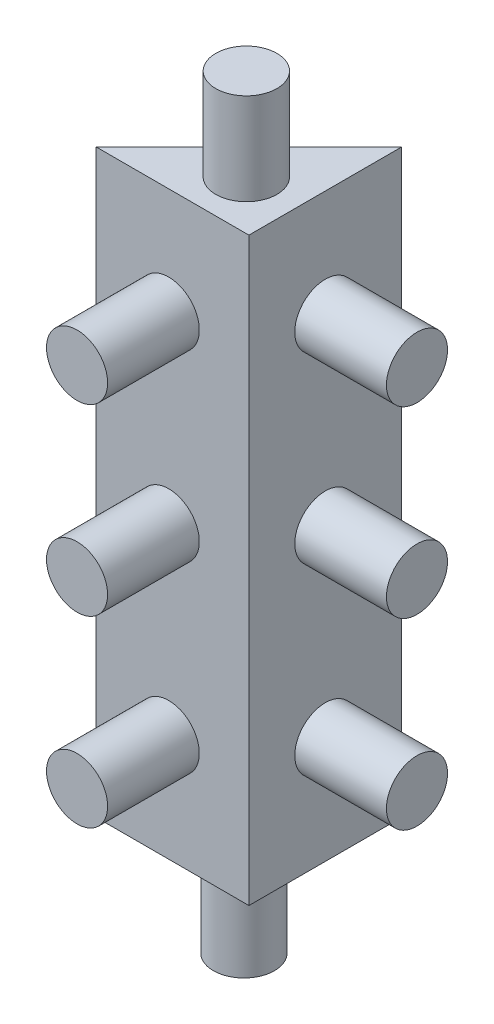
ISO-10303-21;
HEADER;
FILE_DESCRIPTION(('STEP AP214'),'2;1');
FILE_NAME('part.step','',(''),(''),'','','');
FILE_SCHEMA(('AUTOMOTIVE_DESIGN { 1 0 10303 214 1 1 1 1 }'));
ENDSEC;
DATA;
#1=APPLICATION_CONTEXT('core data for automotive mechanical design processes');
#2=APPLICATION_PROTOCOL_DEFINITION('international standard','automotive_design',2000,#1);
#3=PRODUCT_CONTEXT('',#1,'mechanical');
#4=PRODUCT('Part','Part','',(#3));
#5=PRODUCT_RELATED_PRODUCT_CATEGORY('part','',(#4));
#6=PRODUCT_DEFINITION_FORMATION('','',#4);
#7=PRODUCT_DEFINITION_CONTEXT('part definition',#1,'design');
#8=PRODUCT_DEFINITION('design','',#6,#7);
#9=PRODUCT_DEFINITION_SHAPE('','',#8);
#10=(LENGTH_UNIT() NAMED_UNIT(*) SI_UNIT(.MILLI.,.METRE.));
#11=(NAMED_UNIT(*) PLANE_ANGLE_UNIT() SI_UNIT($,.RADIAN.));
#12=(NAMED_UNIT(*) SI_UNIT($,.STERADIAN.) SOLID_ANGLE_UNIT());
#13=UNCERTAINTY_MEASURE_WITH_UNIT(LENGTH_MEASURE(1.E-05),#10,'distance_accuracy_value','');
#14=(GEOMETRIC_REPRESENTATION_CONTEXT(3) GLOBAL_UNCERTAINTY_ASSIGNED_CONTEXT((#13)) GLOBAL_UNIT_ASSIGNED_CONTEXT((#10,
#11,#12)) REPRESENTATION_CONTEXT('',''));
#15=CARTESIAN_POINT('',(0.,0.,0.));
#16=DIRECTION('',(0.,0.,1.));
#17=DIRECTION('',(1.,0.,0.));
#18=AXIS2_PLACEMENT_3D('',#15,#16,#17);
#19=CARTESIAN_POINT('',(6.66438695565709,48.26,-6.66438695565709));
#20=DIRECTION('',(-1.,0.,0.));
#21=DIRECTION('',(0.,0.,1.));
#22=AXIS2_PLACEMENT_3D('',#19,#20,#21);
#23=PLANE('',#22);
#24=CARTESIAN_POINT('',(6.66438695565709,39.37,-0.314386955657094));
#25=DIRECTION('',(-1.,0.,0.));
#26=DIRECTION('',(0.,0.,1.));
#27=AXIS2_PLACEMENT_3D('',#24,#25,#26);
#28=CIRCLE('',#27,2.54);
#29=CARTESIAN_POINT('',(6.66438695565709,39.37,2.22561304434291));
#30=VERTEX_POINT('',#29);
#31=EDGE_CURVE('E55',#30,#30,#28,.F.);
#32=ORIENTED_EDGE('',*,*,#31,.F.);
#33=EDGE_LOOP('',(#32));
#34=FACE_BOUND('',#33,.T.);
#35=CARTESIAN_POINT('',(6.66438695565709,24.13,-0.314386955657094));
#36=DIRECTION('',(-1.,0.,0.));
#37=DIRECTION('',(0.,0.,1.));
#38=AXIS2_PLACEMENT_3D('',#35,#36,#37);
#39=CIRCLE('',#38,2.54);
#40=CARTESIAN_POINT('',(6.66438695565709,24.13,2.22561304434291));
#41=VERTEX_POINT('',#40);
#42=EDGE_CURVE('E115',#41,#41,#39,.F.);
#43=ORIENTED_EDGE('',*,*,#42,.F.);
#44=EDGE_LOOP('',(#43));
#45=FACE_BOUND('',#44,.T.);
#46=CARTESIAN_POINT('',(6.66438695565709,8.89,-0.314386955657094));
#47=DIRECTION('',(-1.,0.,0.));
#48=DIRECTION('',(0.,0.,1.));
#49=AXIS2_PLACEMENT_3D('',#46,#47,#48);
#50=CIRCLE('',#49,2.54);
#51=CARTESIAN_POINT('',(6.66438695565709,8.89,2.22561304434291));
#52=VERTEX_POINT('',#51);
#53=EDGE_CURVE('E112',#52,#52,#50,.F.);
#54=ORIENTED_EDGE('',*,*,#53,.F.);
#55=EDGE_LOOP('',(#54));
#56=FACE_BOUND('',#55,.T.);
#57=DIRECTION('',(0.,0.,-1.));
#58=VECTOR('',#57,1.);
#59=CARTESIAN_POINT('',(6.66438695565709,0.,-6.66438695565709));
#60=LINE('',#59,#58);
#61=CARTESIAN_POINT('',(6.66438695565709,0.,6.03561304434291));
#62=VERTEX_POINT('',#61);
#63=CARTESIAN_POINT('',(6.66438695565709,0.,-6.66438695565709));
#64=VERTEX_POINT('',#63);
#65=EDGE_CURVE('E97',#62,#64,#60,.T.);
#66=ORIENTED_EDGE('',*,*,#65,.T.);
#67=DIRECTION('',(0.,-1.,0.));
#68=VECTOR('',#67,1.);
#69=CARTESIAN_POINT('',(6.66438695565709,48.26,-6.66438695565709));
#70=LINE('',#69,#68);
#71=CARTESIAN_POINT('',(6.66438695565709,48.26,-6.66438695565709));
#72=VERTEX_POINT('',#71);
#73=EDGE_CURVE('E87',#72,#64,#70,.T.);
#74=ORIENTED_EDGE('',*,*,#73,.F.);
#75=DIRECTION('',(0.,0.,-1.));
#76=VECTOR('',#75,1.);
#77=CARTESIAN_POINT('',(6.66438695565709,48.26,-6.66438695565709));
#78=LINE('',#77,#76);
#79=CARTESIAN_POINT('',(6.66438695565709,48.26,6.03561304434291));
#80=VERTEX_POINT('',#79);
#81=EDGE_CURVE('E90',#80,#72,#78,.T.);
#82=ORIENTED_EDGE('',*,*,#81,.F.);
#83=DIRECTION('',(0.,-1.,0.));
#84=VECTOR('',#83,1.);
#85=CARTESIAN_POINT('',(6.66438695565709,48.26,6.03561304434291));
#86=LINE('',#85,#84);
#87=EDGE_CURVE('E103',#80,#62,#86,.T.);
#88=ORIENTED_EDGE('',*,*,#87,.T.);
#89=EDGE_LOOP('',(#66,#74,#82,#88));
#90=FACE_BOUND('',#89,.T.);
#91=ADVANCED_FACE('F47',(#34,#45,#56,#90),#23,.F.);
#92=CARTESIAN_POINT('',(-6.03561304434291,48.26,6.03561304434291));
#93=DIRECTION('',(0.707106781186548,0.,0.707106781186547));
#94=DIRECTION('',(0.707106781186547,0.,-0.707106781186548));
#95=AXIS2_PLACEMENT_3D('',#92,#93,#94);
#96=PLANE('',#95);
#97=DIRECTION('',(-0.707106781186547,0.,0.707106781186548));
#98=VECTOR('',#97,1.);
#99=CARTESIAN_POINT('',(-6.03561304434291,0.,6.03561304434291));
#100=LINE('',#99,#98);
#101=CARTESIAN_POINT('',(-6.03561304434291,0.,6.03561304434291));
#102=VERTEX_POINT('',#101);
#103=EDGE_CURVE('E76',#64,#102,#100,.T.);
#104=ORIENTED_EDGE('',*,*,#103,.T.);
#105=DIRECTION('',(0.,-1.,0.));
#106=VECTOR('',#105,1.);
#107=CARTESIAN_POINT('',(-6.03561304434291,48.26,6.03561304434291));
#108=LINE('',#107,#106);
#109=CARTESIAN_POINT('',(-6.03561304434291,48.26,6.03561304434291));
#110=VERTEX_POINT('',#109);
#111=EDGE_CURVE('E89',#110,#102,#108,.T.);
#112=ORIENTED_EDGE('',*,*,#111,.F.);
#113=DIRECTION('',(-0.707106781186547,0.,0.707106781186548));
#114=VECTOR('',#113,1.);
#115=CARTESIAN_POINT('',(-6.03561304434291,48.26,6.03561304434291));
#116=LINE('',#115,#114);
#117=EDGE_CURVE('E84',#72,#110,#116,.T.);
#118=ORIENTED_EDGE('',*,*,#117,.F.);
#119=ORIENTED_EDGE('',*,*,#73,.T.);
#120=EDGE_LOOP('',(#104,#112,#118,#119));
#121=FACE_BOUND('',#120,.T.);
#122=ADVANCED_FACE('F85',(#121),#96,.F.);
#123=CARTESIAN_POINT('',(-6.03561304434291,48.26,6.03561304434291));
#124=DIRECTION('',(0.,0.,-1.));
#125=DIRECTION('',(-1.,0.,0.));
#126=AXIS2_PLACEMENT_3D('',#123,#124,#125);
#127=PLANE('',#126);
#128=CARTESIAN_POINT('',(0.,39.37,6.03561304434291));
#129=DIRECTION('',(0.,0.,-1.));
#130=DIRECTION('',(-1.,0.,0.));
#131=AXIS2_PLACEMENT_3D('',#128,#129,#130);
#132=CIRCLE('',#131,2.54);
#133=CARTESIAN_POINT('',(-2.54,39.37,6.03561304434291));
#134=VERTEX_POINT('',#133);
#135=EDGE_CURVE('E109',#134,#134,#132,.F.);
#136=ORIENTED_EDGE('',*,*,#135,.F.);
#137=EDGE_LOOP('',(#136));
#138=FACE_BOUND('',#137,.T.);
#139=CARTESIAN_POINT('',(0.,24.13,6.03561304434291));
#140=DIRECTION('',(0.,0.,-1.));
#141=DIRECTION('',(-1.,0.,0.));
#142=AXIS2_PLACEMENT_3D('',#139,#140,#141);
#143=CIRCLE('',#142,2.54);
#144=CARTESIAN_POINT('',(-2.54,24.13,6.03561304434291));
#145=VERTEX_POINT('',#144);
#146=EDGE_CURVE('E101',#145,#145,#143,.F.);
#147=ORIENTED_EDGE('',*,*,#146,.F.);
#148=EDGE_LOOP('',(#147));
#149=FACE_BOUND('',#148,.T.);
#150=CARTESIAN_POINT('',(0.,8.89,6.03561304434291));
#151=DIRECTION('',(0.,0.,-1.));
#152=DIRECTION('',(-1.,0.,0.));
#153=AXIS2_PLACEMENT_3D('',#150,#151,#152);
#154=CIRCLE('',#153,2.54);
#155=CARTESIAN_POINT('',(-2.54,8.89,6.03561304434291));
#156=VERTEX_POINT('',#155);
#157=EDGE_CURVE('E98',#156,#156,#154,.F.);
#158=ORIENTED_EDGE('',*,*,#157,.F.);
#159=EDGE_LOOP('',(#158));
#160=FACE_BOUND('',#159,.T.);
#161=DIRECTION('',(1.,0.,0.));
#162=VECTOR('',#161,1.);
#163=CARTESIAN_POINT('',(-6.03561304434291,0.,6.03561304434291));
#164=LINE('',#163,#162);
#165=EDGE_CURVE('E81',#102,#62,#164,.T.);
#166=ORIENTED_EDGE('',*,*,#165,.T.);
#167=ORIENTED_EDGE('',*,*,#87,.F.);
#168=DIRECTION('',(1.,0.,0.));
#169=VECTOR('',#168,1.);
#170=CARTESIAN_POINT('',(-6.03561304434291,48.26,6.03561304434291));
#171=LINE('',#170,#169);
#172=EDGE_CURVE('E63',#110,#80,#171,.T.);
#173=ORIENTED_EDGE('',*,*,#172,.F.);
#174=ORIENTED_EDGE('',*,*,#111,.T.);
#175=EDGE_LOOP('',(#166,#167,#173,#174));
#176=FACE_BOUND('',#175,.T.);
#177=ADVANCED_FACE('F169',(#138,#149,#160,#176),#127,.F.);
#178=CARTESIAN_POINT('',(0.,48.26,0.));
#179=DIRECTION('',(0.,1.,0.));
#180=DIRECTION('',(0.,0.,1.));
#181=AXIS2_PLACEMENT_3D('',#178,#179,#180);
#182=PLANE('',#181);
#183=CARTESIAN_POINT('',(2.36043583447517,48.26,1.94481378475693));
#184=DIRECTION('',(0.,1.,0.));
#185=DIRECTION('',(0.,0.,1.));
#186=AXIS2_PLACEMENT_3D('',#183,#184,#185);
#187=CIRCLE('',#186,2.54);
#188=CARTESIAN_POINT('',(2.36043583447517,48.26,4.48481378475693));
#189=VERTEX_POINT('',#188);
#190=EDGE_CURVE('E316',#189,#189,#187,.T.);
#191=ORIENTED_EDGE('',*,*,#190,.F.);
#192=EDGE_LOOP('',(#191));
#193=FACE_BOUND('',#192,.T.);
#194=ORIENTED_EDGE('',*,*,#81,.T.);
#195=ORIENTED_EDGE('',*,*,#117,.T.);
#196=ORIENTED_EDGE('',*,*,#172,.T.);
#197=EDGE_LOOP('',(#194,#195,#196));
#198=FACE_BOUND('',#197,.T.);
#199=ADVANCED_FACE('F93',(#193,#198),#182,.T.);
#200=CARTESIAN_POINT('',(0.,0.,0.));
#201=DIRECTION('',(0.,1.,0.));
#202=DIRECTION('',(0.,0.,1.));
#203=AXIS2_PLACEMENT_3D('',#200,#201,#202);
#204=PLANE('',#203);
#205=CARTESIAN_POINT('',(2.25920074041402,0.,2.04604887881808));
#206=DIRECTION('',(0.,1.,0.));
#207=DIRECTION('',(0.,0.,1.));
#208=AXIS2_PLACEMENT_3D('',#205,#206,#207);
#209=CIRCLE('',#208,2.54);
#210=CARTESIAN_POINT('',(2.25920074041402,0.,4.58604887881808));
#211=VERTEX_POINT('',#210);
#212=EDGE_CURVE('E13',#211,#211,#209,.F.);
#213=ORIENTED_EDGE('',*,*,#212,.F.);
#214=EDGE_LOOP('',(#213));
#215=FACE_BOUND('',#214,.T.);
#216=ORIENTED_EDGE('',*,*,#65,.F.);
#217=ORIENTED_EDGE('',*,*,#165,.F.);
#218=ORIENTED_EDGE('',*,*,#103,.F.);
#219=EDGE_LOOP('',(#216,#217,#218));
#220=FACE_BOUND('',#219,.T.);
#221=ADVANCED_FACE('F165',(#215,#220),#204,.F.);
#222=CARTESIAN_POINT('',(0.,8.89,13.6556130443429));
#223=DIRECTION('',(0.,0.,-1.));
#224=DIRECTION('',(-1.,0.,0.));
#225=AXIS2_PLACEMENT_3D('',#222,#223,#224);
#226=CYLINDRICAL_SURFACE('',#225,2.54);
#227=CARTESIAN_POINT('',(0.,8.89,13.6556130443429));
#228=DIRECTION('',(0.,0.,1.));
#229=DIRECTION('',(1.,0.,0.));
#230=AXIS2_PLACEMENT_3D('',#227,#228,#229);
#231=CIRCLE('',#230,2.54);
#232=CARTESIAN_POINT('',(-2.54,8.89,13.6556130443429));
#233=VERTEX_POINT('',#232);
#234=EDGE_CURVE('E338',#233,#233,#231,.T.);
#235=CARTESIAN_POINT('',(-2.54,8.89,13.6556130443429));
#236=CARTESIAN_POINT('',(-2.54,8.89,13.5762380443429));
#237=CARTESIAN_POINT('',(-2.54,8.89,13.4968630443429));
#238=CARTESIAN_POINT('',(-2.54,8.89,13.3381130443429));
#239=CARTESIAN_POINT('',(-2.54,8.89,13.2587380443429));
#240=CARTESIAN_POINT('',(-2.54,8.89,13.0999880443429));
#241=CARTESIAN_POINT('',(-2.54,8.89,13.0206130443429));
#242=CARTESIAN_POINT('',(-2.54,8.89,12.8618630443429));
#243=CARTESIAN_POINT('',(-2.54,8.89,12.7824880443429));
#244=CARTESIAN_POINT('',(-2.54,8.89,12.6237380443429));
#245=CARTESIAN_POINT('',(-2.54,8.89,12.5443630443429));
#246=CARTESIAN_POINT('',(-2.54,8.89,12.3856130443429));
#247=CARTESIAN_POINT('',(-2.54,8.89,12.3062380443429));
#248=CARTESIAN_POINT('',(-2.54,8.89,12.1474880443429));
#249=CARTESIAN_POINT('',(-2.54,8.89,12.0681130443429));
#250=CARTESIAN_POINT('',(-2.54,8.89,11.9093630443429));
#251=CARTESIAN_POINT('',(-2.54,8.89,11.8299880443429));
#252=CARTESIAN_POINT('',(-2.54,8.89,11.6712380443429));
#253=CARTESIAN_POINT('',(-2.54,8.89,11.5918630443429));
#254=CARTESIAN_POINT('',(-2.54,8.89,11.4331130443429));
#255=CARTESIAN_POINT('',(-2.54,8.89,11.3537380443429));
#256=CARTESIAN_POINT('',(-2.54,8.89,11.1949880443429));
#257=CARTESIAN_POINT('',(-2.54,8.89,11.1156130443429));
#258=CARTESIAN_POINT('',(-2.54,8.89,10.9568630443429));
#259=CARTESIAN_POINT('',(-2.54,8.89,10.8774880443429));
#260=CARTESIAN_POINT('',(-2.54,8.89,10.7187380443429));
#261=CARTESIAN_POINT('',(-2.54,8.89,10.6393630443429));
#262=CARTESIAN_POINT('',(-2.54,8.89,10.4806130443429));
#263=CARTESIAN_POINT('',(-2.54,8.89,10.4012380443429));
#264=CARTESIAN_POINT('',(-2.54,8.89,10.2424880443429));
#265=CARTESIAN_POINT('',(-2.54,8.89,10.1631130443429));
#266=CARTESIAN_POINT('',(-2.54,8.89,10.0043630443429));
#267=CARTESIAN_POINT('',(-2.54,8.89,9.9249880443429));
#268=CARTESIAN_POINT('',(-2.54,8.89,9.7662380443429));
#269=CARTESIAN_POINT('',(-2.54,8.89,9.68686304434291));
#270=CARTESIAN_POINT('',(-2.54,8.89,9.52811304434291));
#271=CARTESIAN_POINT('',(-2.54,8.89,9.44873804434291));
#272=CARTESIAN_POINT('',(-2.54,8.89,9.28998804434291));
#273=CARTESIAN_POINT('',(-2.54,8.89,9.2106130443429));
#274=CARTESIAN_POINT('',(-2.54,8.89,9.05186304434291));
#275=CARTESIAN_POINT('',(-2.54,8.89,8.9724880443429));
#276=CARTESIAN_POINT('',(-2.54,8.89,8.81373804434291));
#277=CARTESIAN_POINT('',(-2.54,8.89,8.7343630443429));
#278=CARTESIAN_POINT('',(-2.54,8.89,8.57561304434291));
#279=CARTESIAN_POINT('',(-2.54,8.89,8.4962380443429));
#280=CARTESIAN_POINT('',(-2.54,8.89,8.3374880443429));
#281=CARTESIAN_POINT('',(-2.54,8.89,8.25811304434291));
#282=CARTESIAN_POINT('',(-2.54,8.89,8.09936304434291));
#283=CARTESIAN_POINT('',(-2.54,8.89,8.0199880443429));
#284=CARTESIAN_POINT('',(-2.54,8.89,7.86123804434291));
#285=CARTESIAN_POINT('',(-2.54,8.89,7.7818630443429));
#286=CARTESIAN_POINT('',(-2.54,8.89,7.62311304434291));
#287=CARTESIAN_POINT('',(-2.54,8.89,7.54373804434291));
#288=CARTESIAN_POINT('',(-2.54,8.89,7.38498804434291));
#289=CARTESIAN_POINT('',(-2.54,8.89,7.30561304434291));
#290=CARTESIAN_POINT('',(-2.54,8.89,7.14686304434291));
#291=CARTESIAN_POINT('',(-2.54,8.89,7.06748804434291));
#292=CARTESIAN_POINT('',(-2.54,8.89,6.90873804434291));
#293=CARTESIAN_POINT('',(-2.54,8.89,6.82936304434291));
#294=CARTESIAN_POINT('',(-2.54,8.89,6.67061304434291));
#295=CARTESIAN_POINT('',(-2.54,8.89,6.59123804434291));
#296=CARTESIAN_POINT('',(-2.54,8.89,6.43248804434291));
#297=CARTESIAN_POINT('',(-2.54,8.89,6.35311304434291));
#298=CARTESIAN_POINT('',(-2.54,8.89,6.19436304434291));
#299=CARTESIAN_POINT('',(-2.54,8.89,6.11498804434291));
#300=CARTESIAN_POINT('',(-2.54,8.89,6.03561304434291));
#301=B_SPLINE_CURVE_WITH_KNOTS('',3,(#235,#236,#237,#238,#239,#240,#241,#242,#243,#244,#245,
#246,#247,#248,#249,#250,#251,#252,#253,#254,#255,#256,#257,#258,#259,#260,#261,#262,#263,#264,
#265,#266,#267,#268,#269,#270,#271,#272,#273,#274,#275,#276,#277,#278,#279,#280,#281,#282,#283,
#284,#285,#286,#287,#288,#289,#290,#291,#292,#293,#294,#295,#296,#297,#298,#299,#300),
.UNSPECIFIED.,.F.,.F.,(4,2,2,2,2,2,2,2,2,2,2,2,2,2,2,2,2,2,2,2,2,2,2,2,2,2,2,2,2,2,2,2,4),(0.,
0.238125,0.476250000000001,0.714375000000001,0.9525,1.190625,1.42875,1.666875,1.905,2.143125,
2.38125,2.619375,2.8575,3.095625,3.33375,3.571875,3.81,4.048125,4.28625,4.524375,4.7625,
5.000625,5.23875,5.476875,5.715,5.953125,6.19125,6.429375,6.6675,6.905625,7.14375,7.381875,
7.62),.UNSPECIFIED.);
#302=EDGE_CURVE('BSEAM161',#233,#156,#301,.T.);
#303=ORIENTED_EDGE('',*,*,#234,.F.);
#304=ORIENTED_EDGE('',*,*,#157,.T.);
#305=ORIENTED_EDGE('',*,*,#302,.T.);
#306=ORIENTED_EDGE('',*,*,#302,.F.);
#307=EDGE_LOOP('',(#303,#305,#304,#306));
#308=FACE_BOUND('',#307,.T.);
#309=ADVANCED_FACE('F161',(#308),#226,.T.);
#310=CARTESIAN_POINT('',(0.,8.89,13.6556130443429));
#311=DIRECTION('',(0.,0.,1.));
#312=DIRECTION('',(1.,0.,0.));
#313=AXIS2_PLACEMENT_3D('',#310,#311,#312);
#314=PLANE('',#313);
#315=ORIENTED_EDGE('',*,*,#234,.T.);
#316=EDGE_LOOP('',(#315));
#317=FACE_BOUND('',#316,.T.);
#318=ADVANCED_FACE('F157',(#317),#314,.T.);
#319=CARTESIAN_POINT('',(0.,24.13,13.6556130443429));
#320=DIRECTION('',(0.,0.,-1.));
#321=DIRECTION('',(-1.,0.,0.));
#322=AXIS2_PLACEMENT_3D('',#319,#320,#321);
#323=CYLINDRICAL_SURFACE('',#322,2.54);
#324=CARTESIAN_POINT('',(0.,24.13,13.6556130443429));
#325=DIRECTION('',(0.,0.,1.));
#326=DIRECTION('',(1.,0.,0.));
#327=AXIS2_PLACEMENT_3D('',#324,#325,#326);
#328=CIRCLE('',#327,2.54);
#329=CARTESIAN_POINT('',(-2.54,24.13,13.6556130443429));
#330=VERTEX_POINT('',#329);
#331=EDGE_CURVE('E335',#330,#330,#328,.T.);
#332=CARTESIAN_POINT('',(-2.54,24.13,13.6556130443429));
#333=CARTESIAN_POINT('',(-2.54,24.13,13.5762380443429));
#334=CARTESIAN_POINT('',(-2.54,24.13,13.4968630443429));
#335=CARTESIAN_POINT('',(-2.54,24.13,13.3381130443429));
#336=CARTESIAN_POINT('',(-2.54,24.13,13.2587380443429));
#337=CARTESIAN_POINT('',(-2.54,24.13,13.0999880443429));
#338=CARTESIAN_POINT('',(-2.54,24.13,13.0206130443429));
#339=CARTESIAN_POINT('',(-2.54,24.13,12.8618630443429));
#340=CARTESIAN_POINT('',(-2.54,24.13,12.7824880443429));
#341=CARTESIAN_POINT('',(-2.54,24.13,12.6237380443429));
#342=CARTESIAN_POINT('',(-2.54,24.13,12.5443630443429));
#343=CARTESIAN_POINT('',(-2.54,24.13,12.3856130443429));
#344=CARTESIAN_POINT('',(-2.54,24.13,12.3062380443429));
#345=CARTESIAN_POINT('',(-2.54,24.13,12.1474880443429));
#346=CARTESIAN_POINT('',(-2.54,24.13,12.0681130443429));
#347=CARTESIAN_POINT('',(-2.54,24.13,11.9093630443429));
#348=CARTESIAN_POINT('',(-2.54,24.13,11.8299880443429));
#349=CARTESIAN_POINT('',(-2.54,24.13,11.6712380443429));
#350=CARTESIAN_POINT('',(-2.54,24.13,11.5918630443429));
#351=CARTESIAN_POINT('',(-2.54,24.13,11.4331130443429));
#352=CARTESIAN_POINT('',(-2.54,24.13,11.3537380443429));
#353=CARTESIAN_POINT('',(-2.54,24.13,11.1949880443429));
#354=CARTESIAN_POINT('',(-2.54,24.13,11.1156130443429));
#355=CARTESIAN_POINT('',(-2.54,24.13,10.9568630443429));
#356=CARTESIAN_POINT('',(-2.54,24.13,10.8774880443429));
#357=CARTESIAN_POINT('',(-2.54,24.13,10.7187380443429));
#358=CARTESIAN_POINT('',(-2.54,24.13,10.6393630443429));
#359=CARTESIAN_POINT('',(-2.54,24.13,10.4806130443429));
#360=CARTESIAN_POINT('',(-2.54,24.13,10.4012380443429));
#361=CARTESIAN_POINT('',(-2.54,24.13,10.2424880443429));
#362=CARTESIAN_POINT('',(-2.54,24.13,10.1631130443429));
#363=CARTESIAN_POINT('',(-2.54,24.13,10.0043630443429));
#364=CARTESIAN_POINT('',(-2.54,24.13,9.9249880443429));
#365=CARTESIAN_POINT('',(-2.54,24.13,9.7662380443429));
#366=CARTESIAN_POINT('',(-2.54,24.13,9.68686304434291));
#367=CARTESIAN_POINT('',(-2.54,24.13,9.52811304434291));
#368=CARTESIAN_POINT('',(-2.54,24.13,9.44873804434291));
#369=CARTESIAN_POINT('',(-2.54,24.13,9.28998804434291));
#370=CARTESIAN_POINT('',(-2.54,24.13,9.2106130443429));
#371=CARTESIAN_POINT('',(-2.54,24.13,9.05186304434291));
#372=CARTESIAN_POINT('',(-2.54,24.13,8.9724880443429));
#373=CARTESIAN_POINT('',(-2.54,24.13,8.81373804434291));
#374=CARTESIAN_POINT('',(-2.54,24.13,8.7343630443429));
#375=CARTESIAN_POINT('',(-2.54,24.13,8.57561304434291));
#376=CARTESIAN_POINT('',(-2.54,24.13,8.4962380443429));
#377=CARTESIAN_POINT('',(-2.54,24.13,8.3374880443429));
#378=CARTESIAN_POINT('',(-2.54,24.13,8.25811304434291));
#379=CARTESIAN_POINT('',(-2.54,24.13,8.09936304434291));
#380=CARTESIAN_POINT('',(-2.54,24.13,8.0199880443429));
#381=CARTESIAN_POINT('',(-2.54,24.13,7.86123804434291));
#382=CARTESIAN_POINT('',(-2.54,24.13,7.7818630443429));
#383=CARTESIAN_POINT('',(-2.54,24.13,7.62311304434291));
#384=CARTESIAN_POINT('',(-2.54,24.13,7.54373804434291));
#385=CARTESIAN_POINT('',(-2.54,24.13,7.38498804434291));
#386=CARTESIAN_POINT('',(-2.54,24.13,7.30561304434291));
#387=CARTESIAN_POINT('',(-2.54,24.13,7.14686304434291));
#388=CARTESIAN_POINT('',(-2.54,24.13,7.06748804434291));
#389=CARTESIAN_POINT('',(-2.54,24.13,6.90873804434291));
#390=CARTESIAN_POINT('',(-2.54,24.13,6.82936304434291));
#391=CARTESIAN_POINT('',(-2.54,24.13,6.67061304434291));
#392=CARTESIAN_POINT('',(-2.54,24.13,6.59123804434291));
#393=CARTESIAN_POINT('',(-2.54,24.13,6.43248804434291));
#394=CARTESIAN_POINT('',(-2.54,24.13,6.35311304434291));
#395=CARTESIAN_POINT('',(-2.54,24.13,6.19436304434291));
#396=CARTESIAN_POINT('',(-2.54,24.13,6.11498804434291));
#397=CARTESIAN_POINT('',(-2.54,24.13,6.03561304434291));
#398=B_SPLINE_CURVE_WITH_KNOTS('',3,(#332,#333,#334,#335,#336,#337,#338,#339,#340,#341,#342,
#343,#344,#345,#346,#347,#348,#349,#350,#351,#352,#353,#354,#355,#356,#357,#358,#359,#360,#361,
#362,#363,#364,#365,#366,#367,#368,#369,#370,#371,#372,#373,#374,#375,#376,#377,#378,#379,#380,
#381,#382,#383,#384,#385,#386,#387,#388,#389,#390,#391,#392,#393,#394,#395,#396,#397),
.UNSPECIFIED.,.F.,.F.,(4,2,2,2,2,2,2,2,2,2,2,2,2,2,2,2,2,2,2,2,2,2,2,2,2,2,2,2,2,2,2,2,4),(0.,
0.238125,0.476250000000001,0.714375000000001,0.9525,1.190625,1.42875,1.666875,1.905,2.143125,
2.38125,2.619375,2.8575,3.095625,3.33375,3.571875,3.81,4.048125,4.28625,4.524375,4.7625,
5.000625,5.23875,5.476875,5.715,5.953125,6.19125,6.429375,6.6675,6.905625,7.14375,7.381875,
7.62),.UNSPECIFIED.);
#399=EDGE_CURVE('BSEAM153',#330,#145,#398,.T.);
#400=ORIENTED_EDGE('',*,*,#331,.F.);
#401=ORIENTED_EDGE('',*,*,#146,.T.);
#402=ORIENTED_EDGE('',*,*,#399,.T.);
#403=ORIENTED_EDGE('',*,*,#399,.F.);
#404=EDGE_LOOP('',(#400,#402,#401,#403));
#405=FACE_BOUND('',#404,.T.);
#406=ADVANCED_FACE('F153',(#405),#323,.T.);
#407=CARTESIAN_POINT('',(0.,24.13,13.6556130443429));
#408=DIRECTION('',(0.,0.,1.));
#409=DIRECTION('',(1.,0.,0.));
#410=AXIS2_PLACEMENT_3D('',#407,#408,#409);
#411=PLANE('',#410);
#412=ORIENTED_EDGE('',*,*,#331,.T.);
#413=EDGE_LOOP('',(#412));
#414=FACE_BOUND('',#413,.T.);
#415=ADVANCED_FACE('F149',(#414),#411,.T.);
#416=CARTESIAN_POINT('',(0.,39.37,13.6556130443429));
#417=DIRECTION('',(0.,0.,-1.));
#418=DIRECTION('',(-1.,0.,0.));
#419=AXIS2_PLACEMENT_3D('',#416,#417,#418);
#420=CYLINDRICAL_SURFACE('',#419,2.54);
#421=CARTESIAN_POINT('',(0.,39.37,13.6556130443429));
#422=DIRECTION('',(0.,0.,1.));
#423=DIRECTION('',(1.,0.,0.));
#424=AXIS2_PLACEMENT_3D('',#421,#422,#423);
#425=CIRCLE('',#424,2.54);
#426=CARTESIAN_POINT('',(-2.54,39.37,13.6556130443429));
#427=VERTEX_POINT('',#426);
#428=EDGE_CURVE('E332',#427,#427,#425,.T.);
#429=CARTESIAN_POINT('',(-2.54,39.37,13.6556130443429));
#430=CARTESIAN_POINT('',(-2.54,39.37,13.5762380443429));
#431=CARTESIAN_POINT('',(-2.54,39.37,13.4968630443429));
#432=CARTESIAN_POINT('',(-2.54,39.37,13.3381130443429));
#433=CARTESIAN_POINT('',(-2.54,39.37,13.2587380443429));
#434=CARTESIAN_POINT('',(-2.54,39.37,13.0999880443429));
#435=CARTESIAN_POINT('',(-2.54,39.37,13.0206130443429));
#436=CARTESIAN_POINT('',(-2.54,39.37,12.8618630443429));
#437=CARTESIAN_POINT('',(-2.54,39.37,12.7824880443429));
#438=CARTESIAN_POINT('',(-2.54,39.37,12.6237380443429));
#439=CARTESIAN_POINT('',(-2.54,39.37,12.5443630443429));
#440=CARTESIAN_POINT('',(-2.54,39.37,12.3856130443429));
#441=CARTESIAN_POINT('',(-2.54,39.37,12.3062380443429));
#442=CARTESIAN_POINT('',(-2.54,39.37,12.1474880443429));
#443=CARTESIAN_POINT('',(-2.54,39.37,12.0681130443429));
#444=CARTESIAN_POINT('',(-2.54,39.37,11.9093630443429));
#445=CARTESIAN_POINT('',(-2.54,39.37,11.8299880443429));
#446=CARTESIAN_POINT('',(-2.54,39.37,11.6712380443429));
#447=CARTESIAN_POINT('',(-2.54,39.37,11.5918630443429));
#448=CARTESIAN_POINT('',(-2.54,39.37,11.4331130443429));
#449=CARTESIAN_POINT('',(-2.54,39.37,11.3537380443429));
#450=CARTESIAN_POINT('',(-2.54,39.37,11.1949880443429));
#451=CARTESIAN_POINT('',(-2.54,39.37,11.1156130443429));
#452=CARTESIAN_POINT('',(-2.54,39.37,10.9568630443429));
#453=CARTESIAN_POINT('',(-2.54,39.37,10.8774880443429));
#454=CARTESIAN_POINT('',(-2.54,39.37,10.7187380443429));
#455=CARTESIAN_POINT('',(-2.54,39.37,10.6393630443429));
#456=CARTESIAN_POINT('',(-2.54,39.37,10.4806130443429));
#457=CARTESIAN_POINT('',(-2.54,39.37,10.4012380443429));
#458=CARTESIAN_POINT('',(-2.54,39.37,10.2424880443429));
#459=CARTESIAN_POINT('',(-2.54,39.37,10.1631130443429));
#460=CARTESIAN_POINT('',(-2.54,39.37,10.0043630443429));
#461=CARTESIAN_POINT('',(-2.54,39.37,9.9249880443429));
#462=CARTESIAN_POINT('',(-2.54,39.37,9.7662380443429));
#463=CARTESIAN_POINT('',(-2.54,39.37,9.68686304434291));
#464=CARTESIAN_POINT('',(-2.54,39.37,9.52811304434291));
#465=CARTESIAN_POINT('',(-2.54,39.37,9.44873804434291));
#466=CARTESIAN_POINT('',(-2.54,39.37,9.28998804434291));
#467=CARTESIAN_POINT('',(-2.54,39.37,9.2106130443429));
#468=CARTESIAN_POINT('',(-2.54,39.37,9.05186304434291));
#469=CARTESIAN_POINT('',(-2.54,39.37,8.9724880443429));
#470=CARTESIAN_POINT('',(-2.54,39.37,8.81373804434291));
#471=CARTESIAN_POINT('',(-2.54,39.37,8.7343630443429));
#472=CARTESIAN_POINT('',(-2.54,39.37,8.57561304434291));
#473=CARTESIAN_POINT('',(-2.54,39.37,8.4962380443429));
#474=CARTESIAN_POINT('',(-2.54,39.37,8.3374880443429));
#475=CARTESIAN_POINT('',(-2.54,39.37,8.25811304434291));
#476=CARTESIAN_POINT('',(-2.54,39.37,8.09936304434291));
#477=CARTESIAN_POINT('',(-2.54,39.37,8.0199880443429));
#478=CARTESIAN_POINT('',(-2.54,39.37,7.86123804434291));
#479=CARTESIAN_POINT('',(-2.54,39.37,7.7818630443429));
#480=CARTESIAN_POINT('',(-2.54,39.37,7.62311304434291));
#481=CARTESIAN_POINT('',(-2.54,39.37,7.54373804434291));
#482=CARTESIAN_POINT('',(-2.54,39.37,7.38498804434291));
#483=CARTESIAN_POINT('',(-2.54,39.37,7.30561304434291));
#484=CARTESIAN_POINT('',(-2.54,39.37,7.14686304434291));
#485=CARTESIAN_POINT('',(-2.54,39.37,7.06748804434291));
#486=CARTESIAN_POINT('',(-2.54,39.37,6.90873804434291));
#487=CARTESIAN_POINT('',(-2.54,39.37,6.82936304434291));
#488=CARTESIAN_POINT('',(-2.54,39.37,6.67061304434291));
#489=CARTESIAN_POINT('',(-2.54,39.37,6.59123804434291));
#490=CARTESIAN_POINT('',(-2.54,39.37,6.43248804434291));
#491=CARTESIAN_POINT('',(-2.54,39.37,6.35311304434291));
#492=CARTESIAN_POINT('',(-2.54,39.37,6.19436304434291));
#493=CARTESIAN_POINT('',(-2.54,39.37,6.11498804434291));
#494=CARTESIAN_POINT('',(-2.54,39.37,6.03561304434291));
#495=B_SPLINE_CURVE_WITH_KNOTS('',3,(#429,#430,#431,#432,#433,#434,#435,#436,#437,#438,#439,
#440,#441,#442,#443,#444,#445,#446,#447,#448,#449,#450,#451,#452,#453,#454,#455,#456,#457,#458,
#459,#460,#461,#462,#463,#464,#465,#466,#467,#468,#469,#470,#471,#472,#473,#474,#475,#476,#477,
#478,#479,#480,#481,#482,#483,#484,#485,#486,#487,#488,#489,#490,#491,#492,#493,#494),
.UNSPECIFIED.,.F.,.F.,(4,2,2,2,2,2,2,2,2,2,2,2,2,2,2,2,2,2,2,2,2,2,2,2,2,2,2,2,2,2,2,2,4),(0.,
0.238125,0.476250000000001,0.714375000000001,0.9525,1.190625,1.42875,1.666875,1.905,2.143125,
2.38125,2.619375,2.8575,3.095625,3.33375,3.571875,3.81,4.048125,4.28625,4.524375,4.7625,
5.000625,5.23875,5.476875,5.715,5.953125,6.19125,6.429375,6.6675,6.905625,7.14375,7.381875,
7.62),.UNSPECIFIED.);
#496=EDGE_CURVE('BSEAM141',#427,#134,#495,.T.);
#497=ORIENTED_EDGE('',*,*,#428,.F.);
#498=ORIENTED_EDGE('',*,*,#135,.T.);
#499=ORIENTED_EDGE('',*,*,#496,.T.);
#500=ORIENTED_EDGE('',*,*,#496,.F.);
#501=EDGE_LOOP('',(#497,#499,#498,#500));
#502=FACE_BOUND('',#501,.T.);
#503=ADVANCED_FACE('F141',(#502),#420,.T.);
#504=CARTESIAN_POINT('',(0.,39.37,13.6556130443429));
#505=DIRECTION('',(0.,0.,1.));
#506=DIRECTION('',(1.,0.,0.));
#507=AXIS2_PLACEMENT_3D('',#504,#505,#506);
#508=PLANE('',#507);
#509=ORIENTED_EDGE('',*,*,#428,.T.);
#510=EDGE_LOOP('',(#509));
#511=FACE_BOUND('',#510,.T.);
#512=ADVANCED_FACE('F131',(#511),#508,.T.);
#513=CARTESIAN_POINT('',(14.2843869556571,8.89,-0.314386955657095));
#514=DIRECTION('',(-1.,0.,0.));
#515=DIRECTION('',(0.,0.,1.));
#516=AXIS2_PLACEMENT_3D('',#513,#514,#515);
#517=CYLINDRICAL_SURFACE('',#516,2.54);
#518=CARTESIAN_POINT('',(14.2843869556571,8.89,-0.314386955657095));
#519=DIRECTION('',(1.,0.,0.));
#520=DIRECTION('',(0.,0.,-1.));
#521=AXIS2_PLACEMENT_3D('',#518,#519,#520);
#522=CIRCLE('',#521,2.54);
#523=CARTESIAN_POINT('',(14.2843869556571,8.89,2.22561304434291));
#524=VERTEX_POINT('',#523);
#525=EDGE_CURVE('E329',#524,#524,#522,.T.);
#526=CARTESIAN_POINT('',(14.2843869556571,8.89,2.22561304434291));
#527=CARTESIAN_POINT('',(14.2050119556571,8.89,2.22561304434291));
#528=CARTESIAN_POINT('',(14.1256369556571,8.89,2.22561304434291));
#529=CARTESIAN_POINT('',(13.9668869556571,8.89,2.22561304434291));
#530=CARTESIAN_POINT('',(13.8875119556571,8.89,2.22561304434291));
#531=CARTESIAN_POINT('',(13.7287619556571,8.89,2.22561304434291));
#532=CARTESIAN_POINT('',(13.6493869556571,8.89,2.22561304434291));
#533=CARTESIAN_POINT('',(13.4906369556571,8.89,2.22561304434291));
#534=CARTESIAN_POINT('',(13.4112619556571,8.89,2.22561304434291));
#535=CARTESIAN_POINT('',(13.2525119556571,8.89,2.22561304434291));
#536=CARTESIAN_POINT('',(13.1731369556571,8.89,2.22561304434291));
#537=CARTESIAN_POINT('',(13.0143869556571,8.89,2.22561304434291));
#538=CARTESIAN_POINT('',(12.9350119556571,8.89,2.22561304434291));
#539=CARTESIAN_POINT('',(12.7762619556571,8.89,2.22561304434291));
#540=CARTESIAN_POINT('',(12.6968869556571,8.89,2.22561304434291));
#541=CARTESIAN_POINT('',(12.5381369556571,8.89,2.22561304434291));
#542=CARTESIAN_POINT('',(12.4587619556571,8.89,2.22561304434291));
#543=CARTESIAN_POINT('',(12.3000119556571,8.89,2.22561304434291));
#544=CARTESIAN_POINT('',(12.2206369556571,8.89,2.22561304434291));
#545=CARTESIAN_POINT('',(12.0618869556571,8.89,2.22561304434291));
#546=CARTESIAN_POINT('',(11.9825119556571,8.89,2.22561304434291));
#547=CARTESIAN_POINT('',(11.8237619556571,8.89,2.22561304434291));
#548=CARTESIAN_POINT('',(11.7443869556571,8.89,2.22561304434291));
#549=CARTESIAN_POINT('',(11.5856369556571,8.89,2.22561304434291));
#550=CARTESIAN_POINT('',(11.5062619556571,8.89,2.22561304434291));
#551=CARTESIAN_POINT('',(11.3475119556571,8.89,2.22561304434291));
#552=CARTESIAN_POINT('',(11.2681369556571,8.89,2.22561304434291));
#553=CARTESIAN_POINT('',(11.1093869556571,8.89,2.22561304434291));
#554=CARTESIAN_POINT('',(11.0300119556571,8.89,2.22561304434291));
#555=CARTESIAN_POINT('',(10.8712619556571,8.89,2.22561304434291));
#556=CARTESIAN_POINT('',(10.7918869556571,8.89,2.22561304434291));
#557=CARTESIAN_POINT('',(10.6331369556571,8.89,2.22561304434291));
#558=CARTESIAN_POINT('',(10.5537619556571,8.89,2.22561304434291));
#559=CARTESIAN_POINT('',(10.3950119556571,8.89,2.22561304434291));
#560=CARTESIAN_POINT('',(10.3156369556571,8.89,2.22561304434291));
#561=CARTESIAN_POINT('',(10.1568869556571,8.89,2.22561304434291));
#562=CARTESIAN_POINT('',(10.0775119556571,8.89,2.22561304434291));
#563=CARTESIAN_POINT('',(9.91876195565709,8.89,2.22561304434291));
#564=CARTESIAN_POINT('',(9.83938695565709,8.89,2.22561304434291));
#565=CARTESIAN_POINT('',(9.68063695565709,8.89,2.22561304434291));
#566=CARTESIAN_POINT('',(9.60126195565709,8.89,2.22561304434291));
#567=CARTESIAN_POINT('',(9.44251195565709,8.89,2.22561304434291));
#568=CARTESIAN_POINT('',(9.36313695565709,8.89,2.22561304434291));
#569=CARTESIAN_POINT('',(9.20438695565709,8.89,2.22561304434291));
#570=CARTESIAN_POINT('',(9.12501195565709,8.89,2.22561304434291));
#571=CARTESIAN_POINT('',(8.96626195565709,8.89,2.22561304434291));
#572=CARTESIAN_POINT('',(8.88688695565709,8.89,2.22561304434291));
#573=CARTESIAN_POINT('',(8.72813695565709,8.89,2.22561304434291));
#574=CARTESIAN_POINT('',(8.64876195565709,8.89,2.22561304434291));
#575=CARTESIAN_POINT('',(8.49001195565709,8.89,2.22561304434291));
#576=CARTESIAN_POINT('',(8.41063695565709,8.89,2.22561304434291));
#577=CARTESIAN_POINT('',(8.25188695565709,8.89,2.22561304434291));
#578=CARTESIAN_POINT('',(8.17251195565709,8.89,2.22561304434291));
#579=CARTESIAN_POINT('',(8.01376195565709,8.89,2.22561304434291));
#580=CARTESIAN_POINT('',(7.93438695565709,8.89,2.22561304434291));
#581=CARTESIAN_POINT('',(7.77563695565709,8.89,2.22561304434291));
#582=CARTESIAN_POINT('',(7.69626195565709,8.89,2.22561304434291));
#583=CARTESIAN_POINT('',(7.53751195565709,8.89,2.22561304434291));
#584=CARTESIAN_POINT('',(7.45813695565709,8.89,2.22561304434291));
#585=CARTESIAN_POINT('',(7.29938695565709,8.89,2.22561304434291));
#586=CARTESIAN_POINT('',(7.22001195565709,8.89,2.22561304434291));
#587=CARTESIAN_POINT('',(7.06126195565709,8.89,2.22561304434291));
#588=CARTESIAN_POINT('',(6.98188695565709,8.89,2.22561304434291));
#589=CARTESIAN_POINT('',(6.82313695565709,8.89,2.22561304434291));
#590=CARTESIAN_POINT('',(6.74376195565709,8.89,2.22561304434291));
#591=CARTESIAN_POINT('',(6.66438695565709,8.89,2.22561304434291));
#592=B_SPLINE_CURVE_WITH_KNOTS('',3,(#526,#527,#528,#529,#530,#531,#532,#533,#534,#535,#536,
#537,#538,#539,#540,#541,#542,#543,#544,#545,#546,#547,#548,#549,#550,#551,#552,#553,#554,#555,
#556,#557,#558,#559,#560,#561,#562,#563,#564,#565,#566,#567,#568,#569,#570,#571,#572,#573,#574,
#575,#576,#577,#578,#579,#580,#581,#582,#583,#584,#585,#586,#587,#588,#589,#590,#591),
.UNSPECIFIED.,.F.,.F.,(4,2,2,2,2,2,2,2,2,2,2,2,2,2,2,2,2,2,2,2,2,2,2,2,2,2,2,2,2,2,2,2,4),(0.,
0.238124999999999,0.476249999999999,0.714375,0.952499999999998,1.190625,1.42875,1.666875,1.905,
2.143125,2.38125,2.619375,2.8575,3.095625,3.33375,3.571875,3.81,4.048125,4.28625,4.524375,
4.7625,5.000625,5.23875,5.476875,5.715,5.953125,6.19125,6.429375,6.6675,6.905625,7.14375,
7.381875,7.62),.UNSPECIFIED.);
#593=EDGE_CURVE('BSEAM128',#524,#52,#592,.T.);
#594=ORIENTED_EDGE('',*,*,#525,.F.);
#595=ORIENTED_EDGE('',*,*,#53,.T.);
#596=ORIENTED_EDGE('',*,*,#593,.T.);
#597=ORIENTED_EDGE('',*,*,#593,.F.);
#598=EDGE_LOOP('',(#594,#596,#595,#597));
#599=FACE_BOUND('',#598,.T.);
#600=ADVANCED_FACE('F128',(#599),#517,.T.);
#601=CARTESIAN_POINT('',(14.2843869556571,8.89,-0.314386955657095));
#602=DIRECTION('',(1.,0.,0.));
#603=DIRECTION('',(0.,0.,-1.));
#604=AXIS2_PLACEMENT_3D('',#601,#602,#603);
#605=PLANE('',#604);
#606=ORIENTED_EDGE('',*,*,#525,.T.);
#607=EDGE_LOOP('',(#606));
#608=FACE_BOUND('',#607,.T.);
#609=ADVANCED_FACE('F130',(#608),#605,.T.);
#610=CARTESIAN_POINT('',(14.2843869556571,24.13,-0.314386955657095));
#611=DIRECTION('',(-1.,0.,0.));
#612=DIRECTION('',(0.,0.,1.));
#613=AXIS2_PLACEMENT_3D('',#610,#611,#612);
#614=CYLINDRICAL_SURFACE('',#613,2.54);
#615=CARTESIAN_POINT('',(14.2843869556571,24.13,-0.314386955657095));
#616=DIRECTION('',(1.,0.,0.));
#617=DIRECTION('',(0.,0.,-1.));
#618=AXIS2_PLACEMENT_3D('',#615,#616,#617);
#619=CIRCLE('',#618,2.54);
#620=CARTESIAN_POINT('',(14.2843869556571,24.13,2.22561304434291));
#621=VERTEX_POINT('',#620);
#622=EDGE_CURVE('E326',#621,#621,#619,.T.);
#623=CARTESIAN_POINT('',(14.2843869556571,24.13,2.22561304434291));
#624=CARTESIAN_POINT('',(14.2050119556571,24.13,2.22561304434291));
#625=CARTESIAN_POINT('',(14.1256369556571,24.13,2.22561304434291));
#626=CARTESIAN_POINT('',(13.9668869556571,24.13,2.22561304434291));
#627=CARTESIAN_POINT('',(13.8875119556571,24.13,2.22561304434291));
#628=CARTESIAN_POINT('',(13.7287619556571,24.13,2.22561304434291));
#629=CARTESIAN_POINT('',(13.6493869556571,24.13,2.22561304434291));
#630=CARTESIAN_POINT('',(13.4906369556571,24.13,2.22561304434291));
#631=CARTESIAN_POINT('',(13.4112619556571,24.13,2.22561304434291));
#632=CARTESIAN_POINT('',(13.2525119556571,24.13,2.22561304434291));
#633=CARTESIAN_POINT('',(13.1731369556571,24.13,2.22561304434291));
#634=CARTESIAN_POINT('',(13.0143869556571,24.13,2.22561304434291));
#635=CARTESIAN_POINT('',(12.9350119556571,24.13,2.22561304434291));
#636=CARTESIAN_POINT('',(12.7762619556571,24.13,2.22561304434291));
#637=CARTESIAN_POINT('',(12.6968869556571,24.13,2.22561304434291));
#638=CARTESIAN_POINT('',(12.5381369556571,24.13,2.22561304434291));
#639=CARTESIAN_POINT('',(12.4587619556571,24.13,2.22561304434291));
#640=CARTESIAN_POINT('',(12.3000119556571,24.13,2.22561304434291));
#641=CARTESIAN_POINT('',(12.2206369556571,24.13,2.22561304434291));
#642=CARTESIAN_POINT('',(12.0618869556571,24.13,2.22561304434291));
#643=CARTESIAN_POINT('',(11.9825119556571,24.13,2.22561304434291));
#644=CARTESIAN_POINT('',(11.8237619556571,24.13,2.22561304434291));
#645=CARTESIAN_POINT('',(11.7443869556571,24.13,2.22561304434291));
#646=CARTESIAN_POINT('',(11.5856369556571,24.13,2.22561304434291));
#647=CARTESIAN_POINT('',(11.5062619556571,24.13,2.22561304434291));
#648=CARTESIAN_POINT('',(11.3475119556571,24.13,2.22561304434291));
#649=CARTESIAN_POINT('',(11.2681369556571,24.13,2.22561304434291));
#650=CARTESIAN_POINT('',(11.1093869556571,24.13,2.22561304434291));
#651=CARTESIAN_POINT('',(11.0300119556571,24.13,2.22561304434291));
#652=CARTESIAN_POINT('',(10.8712619556571,24.13,2.22561304434291));
#653=CARTESIAN_POINT('',(10.7918869556571,24.13,2.22561304434291));
#654=CARTESIAN_POINT('',(10.6331369556571,24.13,2.22561304434291));
#655=CARTESIAN_POINT('',(10.5537619556571,24.13,2.22561304434291));
#656=CARTESIAN_POINT('',(10.3950119556571,24.13,2.22561304434291));
#657=CARTESIAN_POINT('',(10.3156369556571,24.13,2.22561304434291));
#658=CARTESIAN_POINT('',(10.1568869556571,24.13,2.22561304434291));
#659=CARTESIAN_POINT('',(10.0775119556571,24.13,2.22561304434291));
#660=CARTESIAN_POINT('',(9.91876195565709,24.13,2.22561304434291));
#661=CARTESIAN_POINT('',(9.83938695565709,24.13,2.22561304434291));
#662=CARTESIAN_POINT('',(9.68063695565709,24.13,2.22561304434291));
#663=CARTESIAN_POINT('',(9.60126195565709,24.13,2.22561304434291));
#664=CARTESIAN_POINT('',(9.44251195565709,24.13,2.22561304434291));
#665=CARTESIAN_POINT('',(9.36313695565709,24.13,2.22561304434291));
#666=CARTESIAN_POINT('',(9.20438695565709,24.13,2.22561304434291));
#667=CARTESIAN_POINT('',(9.12501195565709,24.13,2.22561304434291));
#668=CARTESIAN_POINT('',(8.96626195565709,24.13,2.22561304434291));
#669=CARTESIAN_POINT('',(8.88688695565709,24.13,2.22561304434291));
#670=CARTESIAN_POINT('',(8.72813695565709,24.13,2.22561304434291));
#671=CARTESIAN_POINT('',(8.64876195565709,24.13,2.22561304434291));
#672=CARTESIAN_POINT('',(8.49001195565709,24.13,2.22561304434291));
#673=CARTESIAN_POINT('',(8.41063695565709,24.13,2.22561304434291));
#674=CARTESIAN_POINT('',(8.25188695565709,24.13,2.22561304434291));
#675=CARTESIAN_POINT('',(8.17251195565709,24.13,2.22561304434291));
#676=CARTESIAN_POINT('',(8.01376195565709,24.13,2.22561304434291));
#677=CARTESIAN_POINT('',(7.93438695565709,24.13,2.22561304434291));
#678=CARTESIAN_POINT('',(7.77563695565709,24.13,2.22561304434291));
#679=CARTESIAN_POINT('',(7.69626195565709,24.13,2.22561304434291));
#680=CARTESIAN_POINT('',(7.53751195565709,24.13,2.22561304434291));
#681=CARTESIAN_POINT('',(7.45813695565709,24.13,2.22561304434291));
#682=CARTESIAN_POINT('',(7.29938695565709,24.13,2.22561304434291));
#683=CARTESIAN_POINT('',(7.22001195565709,24.13,2.22561304434291));
#684=CARTESIAN_POINT('',(7.06126195565709,24.13,2.22561304434291));
#685=CARTESIAN_POINT('',(6.98188695565709,24.13,2.22561304434291));
#686=CARTESIAN_POINT('',(6.82313695565709,24.13,2.22561304434291));
#687=CARTESIAN_POINT('',(6.74376195565709,24.13,2.22561304434291));
#688=CARTESIAN_POINT('',(6.66438695565709,24.13,2.22561304434291));
#689=B_SPLINE_CURVE_WITH_KNOTS('',3,(#623,#624,#625,#626,#627,#628,#629,#630,#631,#632,#633,
#634,#635,#636,#637,#638,#639,#640,#641,#642,#643,#644,#645,#646,#647,#648,#649,#650,#651,#652,
#653,#654,#655,#656,#657,#658,#659,#660,#661,#662,#663,#664,#665,#666,#667,#668,#669,#670,#671,
#672,#673,#674,#675,#676,#677,#678,#679,#680,#681,#682,#683,#684,#685,#686,#687,#688),
.UNSPECIFIED.,.F.,.F.,(4,2,2,2,2,2,2,2,2,2,2,2,2,2,2,2,2,2,2,2,2,2,2,2,2,2,2,2,2,2,2,2,4),(0.,
0.238124999999999,0.476249999999999,0.714375,0.952499999999998,1.190625,1.42875,1.666875,1.905,
2.143125,2.38125,2.619375,2.8575,3.095625,3.33375,3.571875,3.81,4.048125,4.28625,4.524375,
4.7625,5.000625,5.23875,5.476875,5.715,5.953125,6.19125,6.429375,6.6675,6.905625,7.14375,
7.381875,7.62),.UNSPECIFIED.);
#690=EDGE_CURVE('BSEAM138',#621,#41,#689,.T.);
#691=ORIENTED_EDGE('',*,*,#622,.F.);
#692=ORIENTED_EDGE('',*,*,#42,.T.);
#693=ORIENTED_EDGE('',*,*,#690,.T.);
#694=ORIENTED_EDGE('',*,*,#690,.F.);
#695=EDGE_LOOP('',(#691,#693,#692,#694));
#696=FACE_BOUND('',#695,.T.);
#697=ADVANCED_FACE('F138',(#696),#614,.T.);
#698=CARTESIAN_POINT('',(14.2843869556571,24.13,-0.314386955657095));
#699=DIRECTION('',(1.,0.,0.));
#700=DIRECTION('',(0.,0.,-1.));
#701=AXIS2_PLACEMENT_3D('',#698,#699,#700);
#702=PLANE('',#701);
#703=ORIENTED_EDGE('',*,*,#622,.T.);
#704=EDGE_LOOP('',(#703));
#705=FACE_BOUND('',#704,.T.);
#706=ADVANCED_FACE('F244',(#705),#702,.T.);
#707=CARTESIAN_POINT('',(14.2843869556571,39.37,-0.314386955657095));
#708=DIRECTION('',(-1.,0.,0.));
#709=DIRECTION('',(0.,0.,1.));
#710=AXIS2_PLACEMENT_3D('',#707,#708,#709);
#711=CYLINDRICAL_SURFACE('',#710,2.54);
#712=CARTESIAN_POINT('',(14.2843869556571,39.37,-0.314386955657095));
#713=DIRECTION('',(1.,0.,0.));
#714=DIRECTION('',(0.,0.,-1.));
#715=AXIS2_PLACEMENT_3D('',#712,#713,#714);
#716=CIRCLE('',#715,2.54);
#717=CARTESIAN_POINT('',(14.2843869556571,39.37,2.22561304434291));
#718=VERTEX_POINT('',#717);
#719=EDGE_CURVE('E319',#718,#718,#716,.T.);
#720=CARTESIAN_POINT('',(14.2843869556571,39.37,2.22561304434291));
#721=CARTESIAN_POINT('',(14.2050119556571,39.37,2.22561304434291));
#722=CARTESIAN_POINT('',(14.1256369556571,39.37,2.22561304434291));
#723=CARTESIAN_POINT('',(13.9668869556571,39.37,2.22561304434291));
#724=CARTESIAN_POINT('',(13.8875119556571,39.37,2.22561304434291));
#725=CARTESIAN_POINT('',(13.7287619556571,39.37,2.22561304434291));
#726=CARTESIAN_POINT('',(13.6493869556571,39.37,2.22561304434291));
#727=CARTESIAN_POINT('',(13.4906369556571,39.37,2.22561304434291));
#728=CARTESIAN_POINT('',(13.4112619556571,39.37,2.22561304434291));
#729=CARTESIAN_POINT('',(13.2525119556571,39.37,2.22561304434291));
#730=CARTESIAN_POINT('',(13.1731369556571,39.37,2.22561304434291));
#731=CARTESIAN_POINT('',(13.0143869556571,39.37,2.22561304434291));
#732=CARTESIAN_POINT('',(12.9350119556571,39.37,2.22561304434291));
#733=CARTESIAN_POINT('',(12.7762619556571,39.37,2.22561304434291));
#734=CARTESIAN_POINT('',(12.6968869556571,39.37,2.22561304434291));
#735=CARTESIAN_POINT('',(12.5381369556571,39.37,2.22561304434291));
#736=CARTESIAN_POINT('',(12.4587619556571,39.37,2.22561304434291));
#737=CARTESIAN_POINT('',(12.3000119556571,39.37,2.22561304434291));
#738=CARTESIAN_POINT('',(12.2206369556571,39.37,2.22561304434291));
#739=CARTESIAN_POINT('',(12.0618869556571,39.37,2.22561304434291));
#740=CARTESIAN_POINT('',(11.9825119556571,39.37,2.22561304434291));
#741=CARTESIAN_POINT('',(11.8237619556571,39.37,2.22561304434291));
#742=CARTESIAN_POINT('',(11.7443869556571,39.37,2.22561304434291));
#743=CARTESIAN_POINT('',(11.5856369556571,39.37,2.22561304434291));
#744=CARTESIAN_POINT('',(11.5062619556571,39.37,2.22561304434291));
#745=CARTESIAN_POINT('',(11.3475119556571,39.37,2.22561304434291));
#746=CARTESIAN_POINT('',(11.2681369556571,39.37,2.22561304434291));
#747=CARTESIAN_POINT('',(11.1093869556571,39.37,2.22561304434291));
#748=CARTESIAN_POINT('',(11.0300119556571,39.37,2.22561304434291));
#749=CARTESIAN_POINT('',(10.8712619556571,39.37,2.22561304434291));
#750=CARTESIAN_POINT('',(10.7918869556571,39.37,2.22561304434291));
#751=CARTESIAN_POINT('',(10.6331369556571,39.37,2.22561304434291));
#752=CARTESIAN_POINT('',(10.5537619556571,39.37,2.22561304434291));
#753=CARTESIAN_POINT('',(10.3950119556571,39.37,2.22561304434291));
#754=CARTESIAN_POINT('',(10.3156369556571,39.37,2.22561304434291));
#755=CARTESIAN_POINT('',(10.1568869556571,39.37,2.22561304434291));
#756=CARTESIAN_POINT('',(10.0775119556571,39.37,2.22561304434291));
#757=CARTESIAN_POINT('',(9.91876195565709,39.37,2.22561304434291));
#758=CARTESIAN_POINT('',(9.83938695565709,39.37,2.22561304434291));
#759=CARTESIAN_POINT('',(9.68063695565709,39.37,2.22561304434291));
#760=CARTESIAN_POINT('',(9.60126195565709,39.37,2.22561304434291));
#761=CARTESIAN_POINT('',(9.44251195565709,39.37,2.22561304434291));
#762=CARTESIAN_POINT('',(9.36313695565709,39.37,2.22561304434291));
#763=CARTESIAN_POINT('',(9.20438695565709,39.37,2.22561304434291));
#764=CARTESIAN_POINT('',(9.12501195565709,39.37,2.22561304434291));
#765=CARTESIAN_POINT('',(8.96626195565709,39.37,2.22561304434291));
#766=CARTESIAN_POINT('',(8.88688695565709,39.37,2.22561304434291));
#767=CARTESIAN_POINT('',(8.72813695565709,39.37,2.22561304434291));
#768=CARTESIAN_POINT('',(8.64876195565709,39.37,2.22561304434291));
#769=CARTESIAN_POINT('',(8.49001195565709,39.37,2.22561304434291));
#770=CARTESIAN_POINT('',(8.41063695565709,39.37,2.22561304434291));
#771=CARTESIAN_POINT('',(8.25188695565709,39.37,2.22561304434291));
#772=CARTESIAN_POINT('',(8.17251195565709,39.37,2.22561304434291));
#773=CARTESIAN_POINT('',(8.01376195565709,39.37,2.22561304434291));
#774=CARTESIAN_POINT('',(7.93438695565709,39.37,2.22561304434291));
#775=CARTESIAN_POINT('',(7.77563695565709,39.37,2.22561304434291));
#776=CARTESIAN_POINT('',(7.69626195565709,39.37,2.22561304434291));
#777=CARTESIAN_POINT('',(7.53751195565709,39.37,2.22561304434291));
#778=CARTESIAN_POINT('',(7.45813695565709,39.37,2.22561304434291));
#779=CARTESIAN_POINT('',(7.29938695565709,39.37,2.22561304434291));
#780=CARTESIAN_POINT('',(7.22001195565709,39.37,2.22561304434291));
#781=CARTESIAN_POINT('',(7.06126195565709,39.37,2.22561304434291));
#782=CARTESIAN_POINT('',(6.98188695565709,39.37,2.22561304434291));
#783=CARTESIAN_POINT('',(6.82313695565709,39.37,2.22561304434291));
#784=CARTESIAN_POINT('',(6.74376195565709,39.37,2.22561304434291));
#785=CARTESIAN_POINT('',(6.66438695565709,39.37,2.22561304434291));
#786=B_SPLINE_CURVE_WITH_KNOTS('',3,(#720,#721,#722,#723,#724,#725,#726,#727,#728,#729,#730,
#731,#732,#733,#734,#735,#736,#737,#738,#739,#740,#741,#742,#743,#744,#745,#746,#747,#748,#749,
#750,#751,#752,#753,#754,#755,#756,#757,#758,#759,#760,#761,#762,#763,#764,#765,#766,#767,#768,
#769,#770,#771,#772,#773,#774,#775,#776,#777,#778,#779,#780,#781,#782,#783,#784,#785),
.UNSPECIFIED.,.F.,.F.,(4,2,2,2,2,2,2,2,2,2,2,2,2,2,2,2,2,2,2,2,2,2,2,2,2,2,2,2,2,2,2,2,4),(0.,
0.238124999999999,0.476249999999999,0.714375,0.952499999999998,1.190625,1.42875,1.666875,1.905,
2.143125,2.38125,2.619375,2.8575,3.095625,3.33375,3.571875,3.81,4.048125,4.28625,4.524375,
4.7625,5.000625,5.23875,5.476875,5.715,5.953125,6.19125,6.429375,6.6675,6.905625,7.14375,
7.381875,7.62),.UNSPECIFIED.);
#787=EDGE_CURVE('BSEAM120',#718,#30,#786,.T.);
#788=ORIENTED_EDGE('',*,*,#719,.F.);
#789=ORIENTED_EDGE('',*,*,#31,.T.);
#790=ORIENTED_EDGE('',*,*,#787,.T.);
#791=ORIENTED_EDGE('',*,*,#787,.F.);
#792=EDGE_LOOP('',(#788,#790,#789,#791));
#793=FACE_BOUND('',#792,.T.);
#794=ADVANCED_FACE('F120',(#793),#711,.T.);
#795=CARTESIAN_POINT('',(14.2843869556571,39.37,-0.314386955657095));
#796=DIRECTION('',(1.,0.,0.));
#797=DIRECTION('',(0.,0.,-1.));
#798=AXIS2_PLACEMENT_3D('',#795,#796,#797);
#799=PLANE('',#798);
#800=ORIENTED_EDGE('',*,*,#719,.T.);
#801=EDGE_LOOP('',(#800));
#802=FACE_BOUND('',#801,.T.);
#803=ADVANCED_FACE('F261',(#802),#799,.T.);
#804=CARTESIAN_POINT('',(2.25920074041402,-7.62,2.04604887881808));
#805=DIRECTION('',(0.,1.,0.));
#806=DIRECTION('',(0.,0.,1.));
#807=AXIS2_PLACEMENT_3D('',#804,#805,#806);
#808=CYLINDRICAL_SURFACE('',#807,2.54);
#809=CARTESIAN_POINT('',(2.25920074041402,-7.62,2.04604887881808));
#810=DIRECTION('',(0.,-1.,0.));
#811=DIRECTION('',(0.,0.,-1.));
#812=AXIS2_PLACEMENT_3D('',#809,#810,#811);
#813=CIRCLE('',#812,2.54);
#814=CARTESIAN_POINT('',(2.25920074041402,-7.62,-0.493951121181922));
#815=VERTEX_POINT('',#814);
#816=EDGE_CURVE('E315',#815,#815,#813,.T.);
#817=ORIENTED_EDGE('',*,*,#816,.F.);
#818=EDGE_LOOP('',(#817));
#819=FACE_BOUND('',#818,.T.);
#820=ORIENTED_EDGE('',*,*,#212,.T.);
#821=EDGE_LOOP('',(#820));
#822=FACE_BOUND('',#821,.T.);
#823=ADVANCED_FACE('F270',(#819,#822),#808,.T.);
#824=CARTESIAN_POINT('',(2.25920074041402,-7.62,2.04604887881808));
#825=DIRECTION('',(0.,-1.,0.));
#826=DIRECTION('',(0.,0.,-1.));
#827=AXIS2_PLACEMENT_3D('',#824,#825,#826);
#828=PLANE('',#827);
#829=ORIENTED_EDGE('',*,*,#816,.T.);
#830=EDGE_LOOP('',(#829));
#831=FACE_BOUND('',#830,.T.);
#832=ADVANCED_FACE('F280',(#831),#828,.T.);
#833=CARTESIAN_POINT('',(2.36043583447517,55.88,1.94481378475693));
#834=DIRECTION('',(0.,-1.,0.));
#835=DIRECTION('',(0.,0.,-1.));
#836=AXIS2_PLACEMENT_3D('',#833,#834,#835);
#837=CYLINDRICAL_SURFACE('',#836,2.54);
#838=CARTESIAN_POINT('',(2.36043583447517,55.88,1.94481378475693));
#839=DIRECTION('',(0.,1.,0.));
#840=DIRECTION('',(0.,0.,1.));
#841=AXIS2_PLACEMENT_3D('',#838,#839,#840);
#842=CIRCLE('',#841,2.54);
#843=CARTESIAN_POINT('',(2.36043583447517,55.88,4.48481378475693));
#844=VERTEX_POINT('',#843);
#845=EDGE_CURVE('E314',#844,#844,#842,.T.);
#846=ORIENTED_EDGE('',*,*,#845,.F.);
#847=EDGE_LOOP('',(#846));
#848=FACE_BOUND('',#847,.T.);
#849=ORIENTED_EDGE('',*,*,#190,.T.);
#850=EDGE_LOOP('',(#849));
#851=FACE_BOUND('',#850,.T.);
#852=ADVANCED_FACE('F286',(#848,#851),#837,.T.);
#853=CARTESIAN_POINT('',(2.36043583447517,55.88,1.94481378475693));
#854=DIRECTION('',(0.,1.,0.));
#855=DIRECTION('',(0.,0.,1.));
#856=AXIS2_PLACEMENT_3D('',#853,#854,#855);
#857=PLANE('',#856);
#858=ORIENTED_EDGE('',*,*,#845,.T.);
#859=EDGE_LOOP('',(#858));
#860=FACE_BOUND('',#859,.T.);
#861=ADVANCED_FACE('F293',(#860),#857,.T.);
#862=CLOSED_SHELL('',(#91,#122,#177,#199,#221,#309,#318,#406,#415,#503,#512,#600,#609,#697,#706,
#794,#803,#823,#832,#852,#861));
#863=MANIFOLD_SOLID_BREP('B2',#862);
#864=ADVANCED_BREP_SHAPE_REPRESENTATION('',(#18,#863),#14);
#865=SHAPE_DEFINITION_REPRESENTATION(#9,#864);
ENDSEC;
END-ISO-10303-21;
